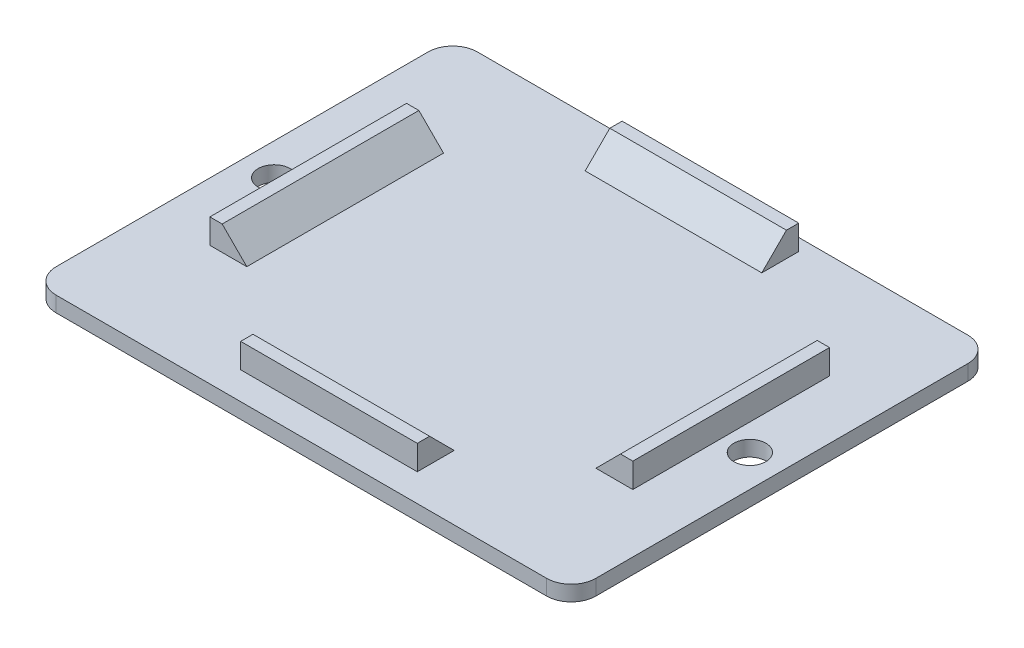
ISO-10303-21;
HEADER;
FILE_DESCRIPTION(('STEP AP214'),'2;1');
FILE_NAME('part.step','',(''),(''),'','','');
FILE_SCHEMA(('AUTOMOTIVE_DESIGN { 1 0 10303 214 1 1 1 1 }'));
ENDSEC;
DATA;
#1=APPLICATION_CONTEXT('core data for automotive mechanical design processes');
#2=APPLICATION_PROTOCOL_DEFINITION('international standard','automotive_design',2000,#1);
#3=PRODUCT_CONTEXT('',#1,'mechanical');
#4=PRODUCT('Part','Part','',(#3));
#5=PRODUCT_RELATED_PRODUCT_CATEGORY('part','',(#4));
#6=PRODUCT_DEFINITION_FORMATION('','',#4);
#7=PRODUCT_DEFINITION_CONTEXT('part definition',#1,'design');
#8=PRODUCT_DEFINITION('design','',#6,#7);
#9=PRODUCT_DEFINITION_SHAPE('','',#8);
#10=(LENGTH_UNIT() NAMED_UNIT(*) SI_UNIT(.MILLI.,.METRE.));
#11=(NAMED_UNIT(*) PLANE_ANGLE_UNIT() SI_UNIT($,.RADIAN.));
#12=(NAMED_UNIT(*) SI_UNIT($,.STERADIAN.) SOLID_ANGLE_UNIT());
#13=UNCERTAINTY_MEASURE_WITH_UNIT(LENGTH_MEASURE(1.E-05),#10,'distance_accuracy_value','');
#14=(GEOMETRIC_REPRESENTATION_CONTEXT(3) GLOBAL_UNCERTAINTY_ASSIGNED_CONTEXT((#13)) GLOBAL_UNIT_ASSIGNED_CONTEXT((#10,
#11,#12)) REPRESENTATION_CONTEXT('',''));
#15=CARTESIAN_POINT('',(0.,0.,0.));
#16=DIRECTION('',(0.,0.,1.));
#17=DIRECTION('',(1.,0.,0.));
#18=AXIS2_PLACEMENT_3D('',#15,#16,#17);
#19=CARTESIAN_POINT('',(0.,4.1275,0.));
#20=DIRECTION('',(0.,-1.,0.));
#21=DIRECTION('',(0.,0.,-1.));
#22=AXIS2_PLACEMENT_3D('',#19,#20,#21);
#23=PLANE('',#22);
#24=DIRECTION('',(0.,0.,1.));
#25=VECTOR('',#24,1.);
#26=CARTESIAN_POINT('',(9.10590000000001,4.1275,-20.4597));
#27=LINE('',#26,#25);
#28=CARTESIAN_POINT('',(9.10590000000001,4.1275,-20.4597));
#29=VERTEX_POINT('',#28);
#30=CARTESIAN_POINT('',(9.10590000000001,4.1275,-19.1897));
#31=VERTEX_POINT('',#30);
#32=EDGE_CURVE('E335',#29,#31,#27,.T.);
#33=ORIENTED_EDGE('',*,*,#32,.F.);
#34=DIRECTION('',(-1.,0.,0.));
#35=VECTOR('',#34,1.);
#36=CARTESIAN_POINT('',(-21.8059,4.1275,-20.4597));
#37=LINE('',#36,#35);
#38=CARTESIAN_POINT('',(-9.10590000000001,4.1275,-20.4597));
#39=VERTEX_POINT('',#38);
#40=EDGE_CURVE('E227',#29,#39,#37,.T.);
#41=ORIENTED_EDGE('',*,*,#40,.T.);
#42=DIRECTION('',(0.,0.,-1.));
#43=VECTOR('',#42,1.);
#44=CARTESIAN_POINT('',(-9.10590000000001,4.1275,-20.4597));
#45=LINE('',#44,#43);
#46=CARTESIAN_POINT('',(-9.10590000000001,4.1275,-19.1897));
#47=VERTEX_POINT('',#46);
#48=EDGE_CURVE('E334',#47,#39,#45,.T.);
#49=ORIENTED_EDGE('',*,*,#48,.F.);
#50=DIRECTION('',(-1.,0.,0.));
#51=VECTOR('',#50,1.);
#52=CARTESIAN_POINT('',(-20.5359,4.1275,-19.1897));
#53=LINE('',#52,#51);
#54=EDGE_CURVE('E319',#31,#47,#53,.T.);
#55=ORIENTED_EDGE('',*,*,#54,.F.);
#56=EDGE_LOOP('',(#33,#41,#49,#55));
#57=FACE_BOUND('',#56,.T.);
#58=ADVANCED_FACE('F34',(#57),#23,.F.);
#59=DIRECTION('',(1.,0.,0.));
#60=VECTOR('',#59,1.);
#61=CARTESIAN_POINT('',(21.8059,4.1275,-10.9347));
#62=LINE('',#61,#60);
#63=CARTESIAN_POINT('',(20.5359,4.1275,-10.9347));
#64=VERTEX_POINT('',#63);
#65=CARTESIAN_POINT('',(21.8059,4.1275,-10.9347));
#66=VERTEX_POINT('',#65);
#67=EDGE_CURVE('E713',#64,#66,#62,.T.);
#68=ORIENTED_EDGE('',*,*,#67,.F.);
#69=DIRECTION('',(0.,0.,-1.));
#70=VECTOR('',#69,1.);
#71=CARTESIAN_POINT('',(20.5359,4.1275,-19.1897));
#72=LINE('',#71,#70);
#73=CARTESIAN_POINT('',(20.5359,4.1275,9.3472));
#74=VERTEX_POINT('',#73);
#75=EDGE_CURVE('E235',#74,#64,#72,.T.);
#76=ORIENTED_EDGE('',*,*,#75,.F.);
#77=DIRECTION('',(-1.,0.,0.));
#78=VECTOR('',#77,1.);
#79=CARTESIAN_POINT('',(21.8059,4.1275,9.3472));
#80=LINE('',#79,#78);
#81=CARTESIAN_POINT('',(21.8059,4.1275,9.3472));
#82=VERTEX_POINT('',#81);
#83=EDGE_CURVE('E741',#82,#74,#80,.T.);
#84=ORIENTED_EDGE('',*,*,#83,.F.);
#85=DIRECTION('',(0.,0.,-1.));
#86=VECTOR('',#85,1.);
#87=CARTESIAN_POINT('',(21.8059,4.1275,-20.4597));
#88=LINE('',#87,#86);
#89=EDGE_CURVE('E220',#82,#66,#88,.T.);
#90=ORIENTED_EDGE('',*,*,#89,.T.);
#91=EDGE_LOOP('',(#68,#76,#84,#90));
#92=FACE_BOUND('',#91,.T.);
#93=ADVANCED_FACE('F447',(#92),#23,.F.);
#94=DIRECTION('',(0.,0.,1.));
#95=VECTOR('',#94,1.);
#96=CARTESIAN_POINT('',(9.10590000000001,4.1275,18.8722));
#97=LINE('',#96,#95);
#98=CARTESIAN_POINT('',(9.10590000000001,4.1275,17.6022));
#99=VERTEX_POINT('',#98);
#100=CARTESIAN_POINT('',(9.10590000000001,4.1275,18.8722));
#101=VERTEX_POINT('',#100);
#102=EDGE_CURVE('E744',#99,#101,#97,.T.);
#103=ORIENTED_EDGE('',*,*,#102,.F.);
#104=DIRECTION('',(1.,0.,0.));
#105=VECTOR('',#104,1.);
#106=CARTESIAN_POINT('',(-20.5359,4.1275,17.6022));
#107=LINE('',#106,#105);
#108=CARTESIAN_POINT('',(-9.10590000000001,4.1275,17.6022));
#109=VERTEX_POINT('',#108);
#110=EDGE_CURVE('E212',#109,#99,#107,.T.);
#111=ORIENTED_EDGE('',*,*,#110,.F.);
#112=DIRECTION('',(0.,0.,-1.));
#113=VECTOR('',#112,1.);
#114=CARTESIAN_POINT('',(-9.10590000000001,4.1275,18.8722));
#115=LINE('',#114,#113);
#116=CARTESIAN_POINT('',(-9.10590000000001,4.1275,18.8722));
#117=VERTEX_POINT('',#116);
#118=EDGE_CURVE('E198',#117,#109,#115,.T.);
#119=ORIENTED_EDGE('',*,*,#118,.F.);
#120=DIRECTION('',(1.,0.,0.));
#121=VECTOR('',#120,1.);
#122=CARTESIAN_POINT('',(-21.8059,4.1275,18.8722));
#123=LINE('',#122,#121);
#124=EDGE_CURVE('E210',#117,#101,#123,.T.);
#125=ORIENTED_EDGE('',*,*,#124,.T.);
#126=EDGE_LOOP('',(#103,#111,#119,#125));
#127=FACE_BOUND('',#126,.T.);
#128=ADVANCED_FACE('F209',(#127),#23,.F.);
#129=DIRECTION('',(-1.,0.,0.));
#130=VECTOR('',#129,1.);
#131=CARTESIAN_POINT('',(-21.8059,4.1275,9.3472));
#132=LINE('',#131,#130);
#133=CARTESIAN_POINT('',(-20.5359,4.1275,9.3472));
#134=VERTEX_POINT('',#133);
#135=CARTESIAN_POINT('',(-21.8059,4.1275,9.3472));
#136=VERTEX_POINT('',#135);
#137=EDGE_CURVE('E214',#134,#136,#132,.T.);
#138=ORIENTED_EDGE('',*,*,#137,.F.);
#139=DIRECTION('',(0.,0.,1.));
#140=VECTOR('',#139,1.);
#141=CARTESIAN_POINT('',(-20.5359,4.1275,-19.1897));
#142=LINE('',#141,#140);
#143=CARTESIAN_POINT('',(-20.5359,4.1275,-10.9347));
#144=VERTEX_POINT('',#143);
#145=EDGE_CURVE('E315',#144,#134,#142,.T.);
#146=ORIENTED_EDGE('',*,*,#145,.F.);
#147=DIRECTION('',(1.,0.,0.));
#148=VECTOR('',#147,1.);
#149=CARTESIAN_POINT('',(-21.8059,4.1275,-10.9347));
#150=LINE('',#149,#148);
#151=CARTESIAN_POINT('',(-21.8059,4.1275,-10.9347));
#152=VERTEX_POINT('',#151);
#153=EDGE_CURVE('E350',#152,#144,#150,.T.);
#154=ORIENTED_EDGE('',*,*,#153,.F.);
#155=DIRECTION('',(0.,0.,1.));
#156=VECTOR('',#155,1.);
#157=CARTESIAN_POINT('',(-21.8059,4.1275,-20.4597));
#158=LINE('',#157,#156);
#159=EDGE_CURVE('E221',#152,#136,#158,.T.);
#160=ORIENTED_EDGE('',*,*,#159,.T.);
#161=EDGE_LOOP('',(#138,#146,#154,#160));
#162=FACE_BOUND('',#161,.T.);
#163=ADVANCED_FACE('F313',(#162),#23,.F.);
#164=CARTESIAN_POINT('',(-21.8059,4.1275,-20.4597));
#165=DIRECTION('',(0.,0.,1.));
#166=DIRECTION('',(1.,0.,0.));
#167=AXIS2_PLACEMENT_3D('',#164,#165,#166);
#168=PLANE('',#167);
#169=DIRECTION('',(0.,-1.,0.));
#170=VECTOR('',#169,1.);
#171=CARTESIAN_POINT('',(9.10590000000001,4.1275,-20.4597));
#172=LINE('',#171,#170);
#173=CARTESIAN_POINT('',(9.10590000000001,1.5875,-20.4597));
#174=VERTEX_POINT('',#173);
#175=EDGE_CURVE('E340',#29,#174,#172,.T.);
#176=ORIENTED_EDGE('',*,*,#175,.T.);
#177=DIRECTION('',(-1.,0.,0.));
#178=VECTOR('',#177,1.);
#179=CARTESIAN_POINT('',(-21.8059,1.5875,-20.4597));
#180=LINE('',#179,#178);
#181=CARTESIAN_POINT('',(-9.10590000000001,1.5875,-20.4597));
#182=VERTEX_POINT('',#181);
#183=EDGE_CURVE('E231',#174,#182,#180,.T.);
#184=ORIENTED_EDGE('',*,*,#183,.T.);
#185=DIRECTION('',(0.,-1.,0.));
#186=VECTOR('',#185,1.);
#187=CARTESIAN_POINT('',(-9.10590000000001,4.1275,-20.4597));
#188=LINE('',#187,#186);
#189=EDGE_CURVE('E343',#39,#182,#188,.T.);
#190=ORIENTED_EDGE('',*,*,#189,.F.);
#191=ORIENTED_EDGE('',*,*,#40,.F.);
#192=EDGE_LOOP('',(#176,#184,#190,#191));
#193=FACE_BOUND('',#192,.T.);
#194=ADVANCED_FACE('F339',(#193),#168,.F.);
#195=CARTESIAN_POINT('',(-21.8059,4.1275,-20.4597));
#196=DIRECTION('',(1.,0.,0.));
#197=DIRECTION('',(0.,0.,-1.));
#198=AXIS2_PLACEMENT_3D('',#195,#196,#197);
#199=PLANE('',#198);
#200=DIRECTION('',(0.,-1.,0.));
#201=VECTOR('',#200,1.);
#202=CARTESIAN_POINT('',(-21.8059,4.1275,9.3472));
#203=LINE('',#202,#201);
#204=CARTESIAN_POINT('',(-21.8059,1.5875,9.3472));
#205=VERTEX_POINT('',#204);
#206=EDGE_CURVE('E204',#136,#205,#203,.T.);
#207=ORIENTED_EDGE('',*,*,#206,.F.);
#208=ORIENTED_EDGE('',*,*,#159,.F.);
#209=DIRECTION('',(0.,-1.,0.));
#210=VECTOR('',#209,1.);
#211=CARTESIAN_POINT('',(-21.8059,4.1275,-10.9347));
#212=LINE('',#211,#210);
#213=CARTESIAN_POINT('',(-21.8059,1.5875,-10.9347));
#214=VERTEX_POINT('',#213);
#215=EDGE_CURVE('E345',#152,#214,#212,.T.);
#216=ORIENTED_EDGE('',*,*,#215,.T.);
#217=DIRECTION('',(0.,0.,1.));
#218=VECTOR('',#217,1.);
#219=CARTESIAN_POINT('',(-21.8059,1.5875,-20.4597));
#220=LINE('',#219,#218);
#221=EDGE_CURVE('E234',#214,#205,#220,.T.);
#222=ORIENTED_EDGE('',*,*,#221,.T.);
#223=EDGE_LOOP('',(#207,#208,#216,#222));
#224=FACE_BOUND('',#223,.T.);
#225=ADVANCED_FACE('F460',(#224),#199,.F.);
#226=CARTESIAN_POINT('',(-21.8059,4.1275,18.8722));
#227=DIRECTION('',(0.,0.,-1.));
#228=DIRECTION('',(-1.,0.,0.));
#229=AXIS2_PLACEMENT_3D('',#226,#227,#228);
#230=PLANE('',#229);
#231=DIRECTION('',(0.,-1.,0.));
#232=VECTOR('',#231,1.);
#233=CARTESIAN_POINT('',(9.10590000000001,4.1275,18.8722));
#234=LINE('',#233,#232);
#235=CARTESIAN_POINT('',(9.10590000000001,1.5875,18.8722));
#236=VERTEX_POINT('',#235);
#237=EDGE_CURVE('E219',#101,#236,#234,.T.);
#238=ORIENTED_EDGE('',*,*,#237,.F.);
#239=ORIENTED_EDGE('',*,*,#124,.F.);
#240=DIRECTION('',(0.,-1.,0.));
#241=VECTOR('',#240,1.);
#242=CARTESIAN_POINT('',(-9.10590000000001,4.1275,18.8722));
#243=LINE('',#242,#241);
#244=CARTESIAN_POINT('',(-9.10590000000001,1.5875,18.8722));
#245=VERTEX_POINT('',#244);
#246=EDGE_CURVE('E195',#117,#245,#243,.T.);
#247=ORIENTED_EDGE('',*,*,#246,.T.);
#248=DIRECTION('',(1.,0.,0.));
#249=VECTOR('',#248,1.);
#250=CARTESIAN_POINT('',(-21.8059,1.5875,18.8722));
#251=LINE('',#250,#249);
#252=EDGE_CURVE('E238',#245,#236,#251,.T.);
#253=ORIENTED_EDGE('',*,*,#252,.T.);
#254=EDGE_LOOP('',(#238,#239,#247,#253));
#255=FACE_BOUND('',#254,.T.);
#256=ADVANCED_FACE('F218',(#255),#230,.F.);
#257=CARTESIAN_POINT('',(21.8059,4.1275,-20.4597));
#258=DIRECTION('',(-1.,0.,0.));
#259=DIRECTION('',(0.,0.,1.));
#260=AXIS2_PLACEMENT_3D('',#257,#258,#259);
#261=PLANE('',#260);
#262=DIRECTION('',(0.,-1.,0.));
#263=VECTOR('',#262,1.);
#264=CARTESIAN_POINT('',(21.8059,4.1275,-10.9347));
#265=LINE('',#264,#263);
#266=CARTESIAN_POINT('',(21.8059,1.5875,-10.9347));
#267=VERTEX_POINT('',#266);
#268=EDGE_CURVE('E716',#66,#267,#265,.T.);
#269=ORIENTED_EDGE('',*,*,#268,.F.);
#270=ORIENTED_EDGE('',*,*,#89,.F.);
#271=DIRECTION('',(0.,-1.,0.));
#272=VECTOR('',#271,1.);
#273=CARTESIAN_POINT('',(21.8059,4.1275,9.3472));
#274=LINE('',#273,#272);
#275=CARTESIAN_POINT('',(21.8059,1.5875,9.3472));
#276=VERTEX_POINT('',#275);
#277=EDGE_CURVE('E720',#82,#276,#274,.T.);
#278=ORIENTED_EDGE('',*,*,#277,.T.);
#279=DIRECTION('',(0.,0.,-1.));
#280=VECTOR('',#279,1.);
#281=CARTESIAN_POINT('',(21.8059,1.5875,-20.4597));
#282=LINE('',#281,#280);
#283=EDGE_CURVE('E240',#276,#267,#282,.T.);
#284=ORIENTED_EDGE('',*,*,#283,.T.);
#285=EDGE_LOOP('',(#269,#270,#278,#284));
#286=FACE_BOUND('',#285,.T.);
#287=ADVANCED_FACE('F478',(#286),#261,.F.);
#288=CARTESIAN_POINT('',(0.,0.,0.));
#289=DIRECTION('',(0.,1.,0.));
#290=DIRECTION('',(0.,0.,1.));
#291=AXIS2_PLACEMENT_3D('',#288,#289,#290);
#292=PLANE('',#291);
#293=CARTESIAN_POINT('',(24.5237,0.,0.));
#294=DIRECTION('',(0.,1.,0.));
#295=DIRECTION('',(0.,0.,1.));
#296=AXIS2_PLACEMENT_3D('',#293,#294,#295);
#297=CIRCLE('',#296,1.651);
#298=CARTESIAN_POINT('',(24.5237,0.,1.651));
#299=VERTEX_POINT('',#298);
#300=EDGE_CURVE('E385',#299,#299,#297,.T.);
#301=ORIENTED_EDGE('',*,*,#300,.T.);
#302=EDGE_LOOP('',(#301));
#303=FACE_BOUND('',#302,.T.);
#304=CARTESIAN_POINT('',(-24.5237,0.,0.));
#305=DIRECTION('',(0.,1.,0.));
#306=DIRECTION('',(0.,0.,1.));
#307=AXIS2_PLACEMENT_3D('',#304,#305,#306);
#308=CIRCLE('',#307,1.651);
#309=CARTESIAN_POINT('',(-24.5237,0.,1.651));
#310=VERTEX_POINT('',#309);
#311=EDGE_CURVE('E323',#310,#310,#308,.T.);
#312=ORIENTED_EDGE('',*,*,#311,.T.);
#313=EDGE_LOOP('',(#312));
#314=FACE_BOUND('',#313,.T.);
#315=DIRECTION('',(1.,0.,0.));
#316=VECTOR('',#315,1.);
#317=CARTESIAN_POINT('',(-27.8257,0.,21.717));
#318=LINE('',#317,#316);
#319=CARTESIAN_POINT('',(-25.2857,0.,21.717));
#320=VERTEX_POINT('',#319);
#321=CARTESIAN_POINT('',(25.2857,0.,21.717));
#322=VERTEX_POINT('',#321);
#323=EDGE_CURVE('E366',#320,#322,#318,.T.);
#324=ORIENTED_EDGE('',*,*,#323,.F.);
#325=CARTESIAN_POINT('',(-25.2857,0.,19.177));
#326=DIRECTION('',(0.,1.,0.));
#327=DIRECTION('',(0.,0.,1.));
#328=AXIS2_PLACEMENT_3D('',#325,#326,#327);
#329=CIRCLE('',#328,2.54);
#330=CARTESIAN_POINT('',(-27.8257,0.,19.177));
#331=VERTEX_POINT('',#330);
#332=EDGE_CURVE('E266',#320,#331,#329,.F.);
#333=ORIENTED_EDGE('',*,*,#332,.T.);
#334=DIRECTION('',(0.,0.,1.));
#335=VECTOR('',#334,1.);
#336=CARTESIAN_POINT('',(-27.8257,0.,-21.717));
#337=LINE('',#336,#335);
#338=CARTESIAN_POINT('',(-27.8257,0.,-19.177));
#339=VERTEX_POINT('',#338);
#340=EDGE_CURVE('E363',#339,#331,#337,.T.);
#341=ORIENTED_EDGE('',*,*,#340,.F.);
#342=CARTESIAN_POINT('',(-25.2857,0.,-19.177));
#343=DIRECTION('',(0.,1.,0.));
#344=DIRECTION('',(0.,0.,1.));
#345=AXIS2_PLACEMENT_3D('',#342,#343,#344);
#346=CIRCLE('',#345,2.54);
#347=CARTESIAN_POINT('',(-25.2857,0.,-21.717));
#348=VERTEX_POINT('',#347);
#349=EDGE_CURVE('E260',#339,#348,#346,.F.);
#350=ORIENTED_EDGE('',*,*,#349,.T.);
#351=DIRECTION('',(-1.,0.,0.));
#352=VECTOR('',#351,1.);
#353=CARTESIAN_POINT('',(27.8257,0.,-21.717));
#354=LINE('',#353,#352);
#355=CARTESIAN_POINT('',(25.2857,0.,-21.717));
#356=VERTEX_POINT('',#355);
#357=EDGE_CURVE('E359',#356,#348,#354,.T.);
#358=ORIENTED_EDGE('',*,*,#357,.F.);
#359=CARTESIAN_POINT('',(25.2857,0.,-19.177));
#360=DIRECTION('',(0.,1.,0.));
#361=DIRECTION('',(0.,0.,1.));
#362=AXIS2_PLACEMENT_3D('',#359,#360,#361);
#363=CIRCLE('',#362,2.54);
#364=CARTESIAN_POINT('',(27.8257,0.,-19.177));
#365=VERTEX_POINT('',#364);
#366=EDGE_CURVE('E262',#356,#365,#363,.F.);
#367=ORIENTED_EDGE('',*,*,#366,.T.);
#368=DIRECTION('',(0.,0.,-1.));
#369=VECTOR('',#368,1.);
#370=CARTESIAN_POINT('',(27.8257,0.,21.717));
#371=LINE('',#370,#369);
#372=CARTESIAN_POINT('',(27.8257,0.,19.177));
#373=VERTEX_POINT('',#372);
#374=EDGE_CURVE('E356',#373,#365,#371,.T.);
#375=ORIENTED_EDGE('',*,*,#374,.F.);
#376=CARTESIAN_POINT('',(25.2857,0.,19.177));
#377=DIRECTION('',(0.,1.,0.));
#378=DIRECTION('',(0.,0.,1.));
#379=AXIS2_PLACEMENT_3D('',#376,#377,#378);
#380=CIRCLE('',#379,2.54);
#381=EDGE_CURVE('E264',#373,#322,#380,.F.);
#382=ORIENTED_EDGE('',*,*,#381,.T.);
#383=EDGE_LOOP('',(#324,#333,#341,#350,#358,#367,#375,#382));
#384=FACE_BOUND('',#383,.T.);
#385=ADVANCED_FACE('F395',(#303,#314,#384),#292,.F.);
#386=CARTESIAN_POINT('',(0.,1.5875,0.));
#387=DIRECTION('',(0.,1.,0.));
#388=DIRECTION('',(0.,0.,1.));
#389=AXIS2_PLACEMENT_3D('',#386,#387,#388);
#390=PLANE('',#389);
#391=DIRECTION('',(-1.,0.,0.));
#392=VECTOR('',#391,1.);
#393=CARTESIAN_POINT('',(-9.10590000000001,1.5875,-16.6497));
#394=LINE('',#393,#392);
#395=CARTESIAN_POINT('',(9.10590000000001,1.5875,-16.6497));
#396=VERTEX_POINT('',#395);
#397=CARTESIAN_POINT('',(-9.10590000000001,1.5875,-16.6497));
#398=VERTEX_POINT('',#397);
#399=EDGE_CURVE('E281',#396,#398,#394,.T.);
#400=ORIENTED_EDGE('',*,*,#399,.T.);
#401=DIRECTION('',(0.,0.,-1.));
#402=VECTOR('',#401,1.);
#403=CARTESIAN_POINT('',(-9.10590000000001,1.5875,-20.4597));
#404=LINE('',#403,#402);
#405=EDGE_CURVE('E353',#398,#182,#404,.T.);
#406=ORIENTED_EDGE('',*,*,#405,.T.);
#407=ORIENTED_EDGE('',*,*,#183,.F.);
#408=DIRECTION('',(0.,0.,1.));
#409=VECTOR('',#408,1.);
#410=CARTESIAN_POINT('',(9.10590000000001,1.5875,-20.4597));
#411=LINE('',#410,#409);
#412=EDGE_CURVE('E712',#174,#396,#411,.T.);
#413=ORIENTED_EDGE('',*,*,#412,.T.);
#414=EDGE_LOOP('',(#400,#406,#407,#413));
#415=FACE_BOUND('',#414,.T.);
#416=DIRECTION('',(0.,0.,1.));
#417=VECTOR('',#416,1.);
#418=CARTESIAN_POINT('',(-17.9959,1.5875,9.3472));
#419=LINE('',#418,#417);
#420=CARTESIAN_POINT('',(-17.9959,1.5875,-10.9347));
#421=VERTEX_POINT('',#420);
#422=CARTESIAN_POINT('',(-17.9959,1.5875,9.3472));
#423=VERTEX_POINT('',#422);
#424=EDGE_CURVE('E278',#421,#423,#419,.T.);
#425=ORIENTED_EDGE('',*,*,#424,.T.);
#426=DIRECTION('',(-1.,0.,0.));
#427=VECTOR('',#426,1.);
#428=CARTESIAN_POINT('',(-21.8059,1.5875,9.3472));
#429=LINE('',#428,#427);
#430=EDGE_CURVE('E215',#423,#205,#429,.T.);
#431=ORIENTED_EDGE('',*,*,#430,.T.);
#432=ORIENTED_EDGE('',*,*,#221,.F.);
#433=DIRECTION('',(1.,0.,0.));
#434=VECTOR('',#433,1.);
#435=CARTESIAN_POINT('',(-21.8059,1.5875,-10.9347));
#436=LINE('',#435,#434);
#437=EDGE_CURVE('E203',#214,#421,#436,.T.);
#438=ORIENTED_EDGE('',*,*,#437,.T.);
#439=EDGE_LOOP('',(#425,#431,#432,#438));
#440=FACE_BOUND('',#439,.T.);
#441=DIRECTION('',(1.,0.,0.));
#442=VECTOR('',#441,1.);
#443=CARTESIAN_POINT('',(9.10590000000001,1.5875,15.0622));
#444=LINE('',#443,#442);
#445=CARTESIAN_POINT('',(-9.10590000000001,1.5875,15.0622));
#446=VERTEX_POINT('',#445);
#447=CARTESIAN_POINT('',(9.10590000000001,1.5875,15.0622));
#448=VERTEX_POINT('',#447);
#449=EDGE_CURVE('E287',#446,#448,#444,.T.);
#450=ORIENTED_EDGE('',*,*,#449,.T.);
#451=DIRECTION('',(0.,0.,1.));
#452=VECTOR('',#451,1.);
#453=CARTESIAN_POINT('',(9.10590000000001,1.5875,18.8722));
#454=LINE('',#453,#452);
#455=EDGE_CURVE('E49',#448,#236,#454,.T.);
#456=ORIENTED_EDGE('',*,*,#455,.T.);
#457=ORIENTED_EDGE('',*,*,#252,.F.);
#458=DIRECTION('',(0.,0.,-1.));
#459=VECTOR('',#458,1.);
#460=CARTESIAN_POINT('',(-9.10590000000001,1.5875,18.8722));
#461=LINE('',#460,#459);
#462=EDGE_CURVE('E57',#245,#446,#461,.T.);
#463=ORIENTED_EDGE('',*,*,#462,.T.);
#464=EDGE_LOOP('',(#450,#456,#457,#463));
#465=FACE_BOUND('',#464,.T.);
#466=DIRECTION('',(0.,0.,-1.));
#467=VECTOR('',#466,1.);
#468=CARTESIAN_POINT('',(17.9959,1.5875,-10.9347));
#469=LINE('',#468,#467);
#470=CARTESIAN_POINT('',(17.9959,1.5875,9.3472));
#471=VERTEX_POINT('',#470);
#472=CARTESIAN_POINT('',(17.9959,1.5875,-10.9347));
#473=VERTEX_POINT('',#472);
#474=EDGE_CURVE('E284',#471,#473,#469,.T.);
#475=ORIENTED_EDGE('',*,*,#474,.T.);
#476=DIRECTION('',(1.,0.,0.));
#477=VECTOR('',#476,1.);
#478=CARTESIAN_POINT('',(21.8059,1.5875,-10.9347));
#479=LINE('',#478,#477);
#480=EDGE_CURVE('E714',#473,#267,#479,.T.);
#481=ORIENTED_EDGE('',*,*,#480,.T.);
#482=ORIENTED_EDGE('',*,*,#283,.F.);
#483=DIRECTION('',(-1.,0.,0.));
#484=VECTOR('',#483,1.);
#485=CARTESIAN_POINT('',(21.8059,1.5875,9.3472));
#486=LINE('',#485,#484);
#487=EDGE_CURVE('E727',#276,#471,#486,.T.);
#488=ORIENTED_EDGE('',*,*,#487,.T.);
#489=EDGE_LOOP('',(#475,#481,#482,#488));
#490=FACE_BOUND('',#489,.T.);
#491=CARTESIAN_POINT('',(24.5237,1.5875,0.));
#492=DIRECTION('',(0.,1.,0.));
#493=DIRECTION('',(0.,0.,1.));
#494=AXIS2_PLACEMENT_3D('',#491,#492,#493);
#495=CIRCLE('',#494,1.651);
#496=CARTESIAN_POINT('',(24.5237,1.5875,1.651));
#497=VERTEX_POINT('',#496);
#498=EDGE_CURVE('E369',#497,#497,#495,.T.);
#499=ORIENTED_EDGE('',*,*,#498,.F.);
#500=EDGE_LOOP('',(#499));
#501=FACE_BOUND('',#500,.T.);
#502=CARTESIAN_POINT('',(-24.5237,1.5875,0.));
#503=DIRECTION('',(0.,1.,0.));
#504=DIRECTION('',(0.,0.,1.));
#505=AXIS2_PLACEMENT_3D('',#502,#503,#504);
#506=CIRCLE('',#505,1.651);
#507=CARTESIAN_POINT('',(-24.5237,1.5875,1.651));
#508=VERTEX_POINT('',#507);
#509=EDGE_CURVE('E382',#508,#508,#506,.T.);
#510=ORIENTED_EDGE('',*,*,#509,.F.);
#511=EDGE_LOOP('',(#510));
#512=FACE_BOUND('',#511,.T.);
#513=DIRECTION('',(0.,0.,1.));
#514=VECTOR('',#513,1.);
#515=CARTESIAN_POINT('',(-27.8257,1.5875,-21.717));
#516=LINE('',#515,#514);
#517=CARTESIAN_POINT('',(-27.8257,1.5875,-19.177));
#518=VERTEX_POINT('',#517);
#519=CARTESIAN_POINT('',(-27.8257,1.5875,19.177));
#520=VERTEX_POINT('',#519);
#521=EDGE_CURVE('E375',#518,#520,#516,.T.);
#522=ORIENTED_EDGE('',*,*,#521,.T.);
#523=CARTESIAN_POINT('',(-25.2857,1.5875,19.177));
#524=DIRECTION('',(0.,1.,0.));
#525=DIRECTION('',(0.,0.,1.));
#526=AXIS2_PLACEMENT_3D('',#523,#524,#525);
#527=CIRCLE('',#526,2.54);
#528=CARTESIAN_POINT('',(-25.2857,1.5875,21.717));
#529=VERTEX_POINT('',#528);
#530=EDGE_CURVE('E253',#520,#529,#527,.T.);
#531=ORIENTED_EDGE('',*,*,#530,.T.);
#532=DIRECTION('',(1.,0.,0.));
#533=VECTOR('',#532,1.);
#534=CARTESIAN_POINT('',(-27.8257,1.5875,21.717));
#535=LINE('',#534,#533);
#536=CARTESIAN_POINT('',(25.2857,1.5875,21.717));
#537=VERTEX_POINT('',#536);
#538=EDGE_CURVE('E360',#529,#537,#535,.T.);
#539=ORIENTED_EDGE('',*,*,#538,.T.);
#540=CARTESIAN_POINT('',(25.2857,1.5875,19.177));
#541=DIRECTION('',(0.,1.,0.));
#542=DIRECTION('',(0.,0.,1.));
#543=AXIS2_PLACEMENT_3D('',#540,#541,#542);
#544=CIRCLE('',#543,2.54);
#545=CARTESIAN_POINT('',(27.8257,1.5875,19.177));
#546=VERTEX_POINT('',#545);
#547=EDGE_CURVE('E251',#537,#546,#544,.T.);
#548=ORIENTED_EDGE('',*,*,#547,.T.);
#549=DIRECTION('',(0.,0.,-1.));
#550=VECTOR('',#549,1.);
#551=CARTESIAN_POINT('',(27.8257,1.5875,21.717));
#552=LINE('',#551,#550);
#553=CARTESIAN_POINT('',(27.8257,1.5875,-19.177));
#554=VERTEX_POINT('',#553);
#555=EDGE_CURVE('E348',#546,#554,#552,.T.);
#556=ORIENTED_EDGE('',*,*,#555,.T.);
#557=CARTESIAN_POINT('',(25.2857,1.5875,-19.177));
#558=DIRECTION('',(0.,1.,0.));
#559=DIRECTION('',(0.,0.,1.));
#560=AXIS2_PLACEMENT_3D('',#557,#558,#559);
#561=CIRCLE('',#560,2.54);
#562=CARTESIAN_POINT('',(25.2857,1.5875,-21.717));
#563=VERTEX_POINT('',#562);
#564=EDGE_CURVE('E249',#554,#563,#561,.T.);
#565=ORIENTED_EDGE('',*,*,#564,.T.);
#566=DIRECTION('',(-1.,0.,0.));
#567=VECTOR('',#566,1.);
#568=CARTESIAN_POINT('',(27.8257,1.5875,-21.717));
#569=LINE('',#568,#567);
#570=CARTESIAN_POINT('',(-25.2857,1.5875,-21.717));
#571=VERTEX_POINT('',#570);
#572=EDGE_CURVE('E372',#563,#571,#569,.T.);
#573=ORIENTED_EDGE('',*,*,#572,.T.);
#574=CARTESIAN_POINT('',(-25.2857,1.5875,-19.177));
#575=DIRECTION('',(0.,1.,0.));
#576=DIRECTION('',(0.,0.,1.));
#577=AXIS2_PLACEMENT_3D('',#574,#575,#576);
#578=CIRCLE('',#577,2.54);
#579=EDGE_CURVE('E247',#571,#518,#578,.T.);
#580=ORIENTED_EDGE('',*,*,#579,.T.);
#581=EDGE_LOOP('',(#522,#531,#539,#548,#556,#565,#573,#580));
#582=FACE_BOUND('',#581,.T.);
#583=ADVANCED_FACE('F392',(#415,#440,#465,#490,#501,#512,#582),#390,.T.);
#584=CARTESIAN_POINT('',(24.5237,0.,0.));
#585=DIRECTION('',(0.,1.,0.));
#586=DIRECTION('',(0.,0.,1.));
#587=AXIS2_PLACEMENT_3D('',#584,#585,#586);
#588=CYLINDRICAL_SURFACE('',#587,1.651);
#589=ORIENTED_EDGE('',*,*,#300,.F.);
#590=EDGE_LOOP('',(#589));
#591=FACE_BOUND('',#590,.T.);
#592=ORIENTED_EDGE('',*,*,#498,.T.);
#593=EDGE_LOOP('',(#592));
#594=FACE_BOUND('',#593,.T.);
#595=ADVANCED_FACE('F390',(#591,#594),#588,.F.);
#596=CARTESIAN_POINT('',(-24.5237,0.,0.));
#597=DIRECTION('',(0.,1.,0.));
#598=DIRECTION('',(0.,0.,1.));
#599=AXIS2_PLACEMENT_3D('',#596,#597,#598);
#600=CYLINDRICAL_SURFACE('',#599,1.651);
#601=ORIENTED_EDGE('',*,*,#311,.F.);
#602=EDGE_LOOP('',(#601));
#603=FACE_BOUND('',#602,.T.);
#604=ORIENTED_EDGE('',*,*,#509,.T.);
#605=EDGE_LOOP('',(#604));
#606=FACE_BOUND('',#605,.T.);
#607=ADVANCED_FACE('F566',(#603,#606),#600,.F.);
#608=CARTESIAN_POINT('',(27.8257,0.,21.717));
#609=DIRECTION('',(1.,0.,0.));
#610=DIRECTION('',(0.,0.,-1.));
#611=AXIS2_PLACEMENT_3D('',#608,#609,#610);
#612=PLANE('',#611);
#613=ORIENTED_EDGE('',*,*,#555,.F.);
#614=DIRECTION('',(0.,1.,0.));
#615=VECTOR('',#614,1.);
#616=CARTESIAN_POINT('',(27.8257,0.,19.177));
#617=LINE('',#616,#615);
#618=EDGE_CURVE('E271',#546,#373,#617,.F.);
#619=ORIENTED_EDGE('',*,*,#618,.T.);
#620=ORIENTED_EDGE('',*,*,#374,.T.);
#621=DIRECTION('',(0.,1.,0.));
#622=VECTOR('',#621,1.);
#623=CARTESIAN_POINT('',(27.8257,0.,-19.177));
#624=LINE('',#623,#622);
#625=EDGE_CURVE('E268',#365,#554,#624,.T.);
#626=ORIENTED_EDGE('',*,*,#625,.T.);
#627=EDGE_LOOP('',(#613,#619,#620,#626));
#628=FACE_BOUND('',#627,.T.);
#629=ADVANCED_FACE('F426',(#628),#612,.T.);
#630=CARTESIAN_POINT('',(-27.8257,0.,21.717));
#631=DIRECTION('',(0.,0.,1.));
#632=DIRECTION('',(1.,0.,0.));
#633=AXIS2_PLACEMENT_3D('',#630,#631,#632);
#634=PLANE('',#633);
#635=ORIENTED_EDGE('',*,*,#538,.F.);
#636=DIRECTION('',(0.,1.,0.));
#637=VECTOR('',#636,1.);
#638=CARTESIAN_POINT('',(-25.2857,0.,21.717));
#639=LINE('',#638,#637);
#640=EDGE_CURVE('E258',#529,#320,#639,.F.);
#641=ORIENTED_EDGE('',*,*,#640,.T.);
#642=ORIENTED_EDGE('',*,*,#323,.T.);
#643=DIRECTION('',(0.,1.,0.));
#644=VECTOR('',#643,1.);
#645=CARTESIAN_POINT('',(25.2857,0.,21.717));
#646=LINE('',#645,#644);
#647=EDGE_CURVE('E255',#322,#537,#646,.T.);
#648=ORIENTED_EDGE('',*,*,#647,.T.);
#649=EDGE_LOOP('',(#635,#641,#642,#648));
#650=FACE_BOUND('',#649,.T.);
#651=ADVANCED_FACE('F433',(#650),#634,.T.);
#652=CARTESIAN_POINT('',(-27.8257,0.,-21.717));
#653=DIRECTION('',(-1.,0.,0.));
#654=DIRECTION('',(0.,0.,1.));
#655=AXIS2_PLACEMENT_3D('',#652,#653,#654);
#656=PLANE('',#655);
#657=ORIENTED_EDGE('',*,*,#340,.T.);
#658=DIRECTION('',(0.,1.,0.));
#659=VECTOR('',#658,1.);
#660=CARTESIAN_POINT('',(-27.8257,0.,19.177));
#661=LINE('',#660,#659);
#662=EDGE_CURVE('E244',#331,#520,#661,.T.);
#663=ORIENTED_EDGE('',*,*,#662,.T.);
#664=ORIENTED_EDGE('',*,*,#521,.F.);
#665=DIRECTION('',(0.,1.,0.));
#666=VECTOR('',#665,1.);
#667=CARTESIAN_POINT('',(-27.8257,0.,-19.177));
#668=LINE('',#667,#666);
#669=EDGE_CURVE('E224',#518,#339,#668,.F.);
#670=ORIENTED_EDGE('',*,*,#669,.T.);
#671=EDGE_LOOP('',(#657,#663,#664,#670));
#672=FACE_BOUND('',#671,.T.);
#673=ADVANCED_FACE('F404',(#672),#656,.T.);
#674=CARTESIAN_POINT('',(27.8257,0.,-21.717));
#675=DIRECTION('',(0.,0.,-1.));
#676=DIRECTION('',(-1.,0.,0.));
#677=AXIS2_PLACEMENT_3D('',#674,#675,#676);
#678=PLANE('',#677);
#679=ORIENTED_EDGE('',*,*,#572,.F.);
#680=DIRECTION('',(0.,1.,0.));
#681=VECTOR('',#680,1.);
#682=CARTESIAN_POINT('',(25.2857,0.,-21.717));
#683=LINE('',#682,#681);
#684=EDGE_CURVE('E276',#563,#356,#683,.F.);
#685=ORIENTED_EDGE('',*,*,#684,.T.);
#686=ORIENTED_EDGE('',*,*,#357,.T.);
#687=DIRECTION('',(0.,1.,0.));
#688=VECTOR('',#687,1.);
#689=CARTESIAN_POINT('',(-25.2857,0.,-21.717));
#690=LINE('',#689,#688);
#691=EDGE_CURVE('E273',#348,#571,#690,.T.);
#692=ORIENTED_EDGE('',*,*,#691,.T.);
#693=EDGE_LOOP('',(#679,#685,#686,#692));
#694=FACE_BOUND('',#693,.T.);
#695=ADVANCED_FACE('F417',(#694),#678,.T.);
#696=CARTESIAN_POINT('',(-25.2857,0.,19.177));
#697=DIRECTION('',(0.,1.,0.));
#698=DIRECTION('',(0.,0.,1.));
#699=AXIS2_PLACEMENT_3D('',#696,#697,#698);
#700=CYLINDRICAL_SURFACE('',#699,2.54);
#701=ORIENTED_EDGE('',*,*,#332,.F.);
#702=ORIENTED_EDGE('',*,*,#640,.F.);
#703=ORIENTED_EDGE('',*,*,#530,.F.);
#704=ORIENTED_EDGE('',*,*,#662,.F.);
#705=EDGE_LOOP('',(#701,#702,#703,#704));
#706=FACE_BOUND('',#705,.T.);
#707=ADVANCED_FACE('F436',(#706),#700,.T.);
#708=CARTESIAN_POINT('',(25.2857,0.,19.177));
#709=DIRECTION('',(0.,1.,0.));
#710=DIRECTION('',(0.,0.,1.));
#711=AXIS2_PLACEMENT_3D('',#708,#709,#710);
#712=CYLINDRICAL_SURFACE('',#711,2.54);
#713=ORIENTED_EDGE('',*,*,#381,.F.);
#714=ORIENTED_EDGE('',*,*,#618,.F.);
#715=ORIENTED_EDGE('',*,*,#547,.F.);
#716=ORIENTED_EDGE('',*,*,#647,.F.);
#717=EDGE_LOOP('',(#713,#714,#715,#716));
#718=FACE_BOUND('',#717,.T.);
#719=ADVANCED_FACE('F429',(#718),#712,.T.);
#720=CARTESIAN_POINT('',(25.2857,0.,-19.177));
#721=DIRECTION('',(0.,1.,0.));
#722=DIRECTION('',(0.,0.,1.));
#723=AXIS2_PLACEMENT_3D('',#720,#721,#722);
#724=CYLINDRICAL_SURFACE('',#723,2.54);
#725=ORIENTED_EDGE('',*,*,#366,.F.);
#726=ORIENTED_EDGE('',*,*,#684,.F.);
#727=ORIENTED_EDGE('',*,*,#564,.F.);
#728=ORIENTED_EDGE('',*,*,#625,.F.);
#729=EDGE_LOOP('',(#725,#726,#727,#728));
#730=FACE_BOUND('',#729,.T.);
#731=ADVANCED_FACE('F420',(#730),#724,.T.);
#732=CARTESIAN_POINT('',(-25.2857,0.,-19.177));
#733=DIRECTION('',(0.,1.,0.));
#734=DIRECTION('',(0.,0.,1.));
#735=AXIS2_PLACEMENT_3D('',#732,#733,#734);
#736=CYLINDRICAL_SURFACE('',#735,2.54);
#737=ORIENTED_EDGE('',*,*,#349,.F.);
#738=ORIENTED_EDGE('',*,*,#669,.F.);
#739=ORIENTED_EDGE('',*,*,#579,.F.);
#740=ORIENTED_EDGE('',*,*,#691,.F.);
#741=EDGE_LOOP('',(#737,#738,#739,#740));
#742=FACE_BOUND('',#741,.T.);
#743=ADVANCED_FACE('F409',(#742),#736,.T.);
#744=CARTESIAN_POINT('',(21.8059,4.1275,9.3472));
#745=DIRECTION('',(0.,0.,1.));
#746=DIRECTION('',(1.,0.,0.));
#747=AXIS2_PLACEMENT_3D('',#744,#745,#746);
#748=PLANE('',#747);
#749=ORIENTED_EDGE('',*,*,#487,.F.);
#750=ORIENTED_EDGE('',*,*,#277,.F.);
#751=ORIENTED_EDGE('',*,*,#83,.T.);
#752=DIRECTION('',(0.70710678118655,0.707106781186545,0.));
#753=VECTOR('',#752,1.);
#754=CARTESIAN_POINT('',(17.9959,1.5875,9.3472));
#755=LINE('',#754,#753);
#756=EDGE_CURVE('E295',#74,#471,#755,.F.);
#757=ORIENTED_EDGE('',*,*,#756,.T.);
#758=EDGE_LOOP('',(#749,#750,#751,#757));
#759=FACE_BOUND('',#758,.T.);
#760=ADVANCED_FACE('F516',(#759),#748,.T.);
#761=CARTESIAN_POINT('',(9.10590000000001,4.1275,18.8722));
#762=DIRECTION('',(1.,0.,0.));
#763=DIRECTION('',(0.,0.,-1.));
#764=AXIS2_PLACEMENT_3D('',#761,#762,#763);
#765=PLANE('',#764);
#766=ORIENTED_EDGE('',*,*,#102,.T.);
#767=ORIENTED_EDGE('',*,*,#237,.T.);
#768=ORIENTED_EDGE('',*,*,#455,.F.);
#769=DIRECTION('',(0.,-0.707106781186545,-0.70710678118655));
#770=VECTOR('',#769,1.);
#771=CARTESIAN_POINT('',(9.10590000000001,1.5875,15.0622));
#772=LINE('',#771,#770);
#773=EDGE_CURVE('E289',#448,#99,#772,.F.);
#774=ORIENTED_EDGE('',*,*,#773,.T.);
#775=EDGE_LOOP('',(#766,#767,#768,#774));
#776=FACE_BOUND('',#775,.T.);
#777=ADVANCED_FACE('F605',(#776),#765,.T.);
#778=CARTESIAN_POINT('',(9.10590000000001,4.1275,-20.4597));
#779=DIRECTION('',(1.,0.,0.));
#780=DIRECTION('',(0.,0.,-1.));
#781=AXIS2_PLACEMENT_3D('',#778,#779,#780);
#782=PLANE('',#781);
#783=ORIENTED_EDGE('',*,*,#412,.F.);
#784=ORIENTED_EDGE('',*,*,#175,.F.);
#785=ORIENTED_EDGE('',*,*,#32,.T.);
#786=DIRECTION('',(0.,0.707106781186543,-0.707106781186552));
#787=VECTOR('',#786,1.);
#788=CARTESIAN_POINT('',(9.10590000000001,1.5875,-16.6497));
#789=LINE('',#788,#787);
#790=EDGE_CURVE('E300',#31,#396,#789,.F.);
#791=ORIENTED_EDGE('',*,*,#790,.T.);
#792=EDGE_LOOP('',(#783,#784,#785,#791));
#793=FACE_BOUND('',#792,.T.);
#794=ADVANCED_FACE('F615',(#793),#782,.T.);
#795=CARTESIAN_POINT('',(21.8059,4.1275,-10.9347));
#796=DIRECTION('',(0.,0.,-1.));
#797=DIRECTION('',(-1.,0.,0.));
#798=AXIS2_PLACEMENT_3D('',#795,#796,#797);
#799=PLANE('',#798);
#800=ORIENTED_EDGE('',*,*,#67,.T.);
#801=ORIENTED_EDGE('',*,*,#268,.T.);
#802=ORIENTED_EDGE('',*,*,#480,.F.);
#803=DIRECTION('',(-0.70710678118655,-0.707106781186545,0.));
#804=VECTOR('',#803,1.);
#805=CARTESIAN_POINT('',(17.9959,1.5875,-10.9347));
#806=LINE('',#805,#804);
#807=EDGE_CURVE('E293',#473,#64,#806,.F.);
#808=ORIENTED_EDGE('',*,*,#807,.T.);
#809=EDGE_LOOP('',(#800,#801,#802,#808));
#810=FACE_BOUND('',#809,.T.);
#811=ADVANCED_FACE('F624',(#810),#799,.T.);
#812=CARTESIAN_POINT('',(-9.10590000000001,4.1275,18.8722));
#813=DIRECTION('',(-1.,0.,0.));
#814=DIRECTION('',(0.,0.,1.));
#815=AXIS2_PLACEMENT_3D('',#812,#813,#814);
#816=PLANE('',#815);
#817=ORIENTED_EDGE('',*,*,#462,.F.);
#818=ORIENTED_EDGE('',*,*,#246,.F.);
#819=ORIENTED_EDGE('',*,*,#118,.T.);
#820=DIRECTION('',(0.,0.707106781186545,0.70710678118655));
#821=VECTOR('',#820,1.);
#822=CARTESIAN_POINT('',(-9.10590000000001,1.5875,15.0622));
#823=LINE('',#822,#821);
#824=EDGE_CURVE('E291',#109,#446,#823,.F.);
#825=ORIENTED_EDGE('',*,*,#824,.T.);
#826=EDGE_LOOP('',(#817,#818,#819,#825));
#827=FACE_BOUND('',#826,.T.);
#828=ADVANCED_FACE('F197',(#827),#816,.T.);
#829=CARTESIAN_POINT('',(-21.8059,4.1275,9.3472));
#830=DIRECTION('',(0.,0.,1.));
#831=DIRECTION('',(1.,0.,0.));
#832=AXIS2_PLACEMENT_3D('',#829,#830,#831);
#833=PLANE('',#832);
#834=ORIENTED_EDGE('',*,*,#137,.T.);
#835=ORIENTED_EDGE('',*,*,#206,.T.);
#836=ORIENTED_EDGE('',*,*,#430,.F.);
#837=DIRECTION('',(0.707106781186551,-0.707106781186544,0.));
#838=VECTOR('',#837,1.);
#839=CARTESIAN_POINT('',(-17.9959,1.5875,9.3472));
#840=LINE('',#839,#838);
#841=EDGE_CURVE('E42',#423,#134,#840,.F.);
#842=ORIENTED_EDGE('',*,*,#841,.T.);
#843=EDGE_LOOP('',(#834,#835,#836,#842));
#844=FACE_BOUND('',#843,.T.);
#845=ADVANCED_FACE('F305',(#844),#833,.T.);
#846=CARTESIAN_POINT('',(-21.8059,4.1275,-10.9347));
#847=DIRECTION('',(0.,0.,-1.));
#848=DIRECTION('',(-1.,0.,0.));
#849=AXIS2_PLACEMENT_3D('',#846,#847,#848);
#850=PLANE('',#849);
#851=ORIENTED_EDGE('',*,*,#437,.F.);
#852=ORIENTED_EDGE('',*,*,#215,.F.);
#853=ORIENTED_EDGE('',*,*,#153,.T.);
#854=DIRECTION('',(-0.707106781186551,0.707106781186544,0.));
#855=VECTOR('',#854,1.);
#856=CARTESIAN_POINT('',(-17.9959,1.5875,-10.9347));
#857=LINE('',#856,#855);
#858=EDGE_CURVE('E11',#144,#421,#857,.F.);
#859=ORIENTED_EDGE('',*,*,#858,.T.);
#860=EDGE_LOOP('',(#851,#852,#853,#859));
#861=FACE_BOUND('',#860,.T.);
#862=ADVANCED_FACE('F651',(#861),#850,.T.);
#863=CARTESIAN_POINT('',(-9.10590000000001,4.1275,-20.4597));
#864=DIRECTION('',(-1.,0.,0.));
#865=DIRECTION('',(0.,0.,1.));
#866=AXIS2_PLACEMENT_3D('',#863,#864,#865);
#867=PLANE('',#866);
#868=ORIENTED_EDGE('',*,*,#48,.T.);
#869=ORIENTED_EDGE('',*,*,#189,.T.);
#870=ORIENTED_EDGE('',*,*,#405,.F.);
#871=DIRECTION('',(0.,-0.707106781186543,0.707106781186552));
#872=VECTOR('',#871,1.);
#873=CARTESIAN_POINT('',(-9.10590000000001,1.5875,-16.6497));
#874=LINE('',#873,#872);
#875=EDGE_CURVE('E298',#398,#47,#874,.F.);
#876=ORIENTED_EDGE('',*,*,#875,.T.);
#877=EDGE_LOOP('',(#868,#869,#870,#876));
#878=FACE_BOUND('',#877,.T.);
#879=ADVANCED_FACE('F660',(#878),#867,.T.);
#880=CARTESIAN_POINT('',(0.,1.5875,15.0622));
#881=DIRECTION('',(0.,0.70710678118655,-0.707106781186545));
#882=DIRECTION('',(-1.,0.,0.));
#883=AXIS2_PLACEMENT_3D('',#880,#881,#882);
#884=PLANE('',#883);
#885=ORIENTED_EDGE('',*,*,#824,.F.);
#886=ORIENTED_EDGE('',*,*,#110,.T.);
#887=ORIENTED_EDGE('',*,*,#773,.F.);
#888=ORIENTED_EDGE('',*,*,#449,.F.);
#889=EDGE_LOOP('',(#885,#886,#887,#888));
#890=FACE_BOUND('',#889,.T.);
#891=ADVANCED_FACE('F670',(#890),#884,.T.);
#892=CARTESIAN_POINT('',(17.9959,1.5875,0.));
#893=DIRECTION('',(-0.707106781186545,0.70710678118655,0.));
#894=DIRECTION('',(0.,0.,1.));
#895=AXIS2_PLACEMENT_3D('',#892,#893,#894);
#896=PLANE('',#895);
#897=ORIENTED_EDGE('',*,*,#756,.F.);
#898=ORIENTED_EDGE('',*,*,#75,.T.);
#899=ORIENTED_EDGE('',*,*,#807,.F.);
#900=ORIENTED_EDGE('',*,*,#474,.F.);
#901=EDGE_LOOP('',(#897,#898,#899,#900));
#902=FACE_BOUND('',#901,.T.);
#903=ADVANCED_FACE('F679',(#902),#896,.T.);
#904=CARTESIAN_POINT('',(0.,1.5875,-16.6497));
#905=DIRECTION('',(0.,0.707106781186552,0.707106781186543));
#906=DIRECTION('',(1.,0.,0.));
#907=AXIS2_PLACEMENT_3D('',#904,#905,#906);
#908=PLANE('',#907);
#909=ORIENTED_EDGE('',*,*,#790,.F.);
#910=ORIENTED_EDGE('',*,*,#54,.T.);
#911=ORIENTED_EDGE('',*,*,#875,.F.);
#912=ORIENTED_EDGE('',*,*,#399,.F.);
#913=EDGE_LOOP('',(#909,#910,#911,#912));
#914=FACE_BOUND('',#913,.T.);
#915=ADVANCED_FACE('F689',(#914),#908,.T.);
#916=CARTESIAN_POINT('',(-17.9959,1.5875,0.));
#917=DIRECTION('',(0.707106781186544,0.707106781186551,0.));
#918=DIRECTION('',(0.,0.,-1.));
#919=AXIS2_PLACEMENT_3D('',#916,#917,#918);
#920=PLANE('',#919);
#921=ORIENTED_EDGE('',*,*,#858,.F.);
#922=ORIENTED_EDGE('',*,*,#145,.T.);
#923=ORIENTED_EDGE('',*,*,#841,.F.);
#924=ORIENTED_EDGE('',*,*,#424,.F.);
#925=EDGE_LOOP('',(#921,#922,#923,#924));
#926=FACE_BOUND('',#925,.T.);
#927=ADVANCED_FACE('F36',(#926),#920,.T.);
#928=CLOSED_SHELL('',(#58,#93,#128,#163,#194,#225,#256,#287,#385,#583,#595,#607,#629,#651,#673,
#695,#707,#719,#731,#743,#760,#777,#794,#811,#828,#845,#862,#879,#891,#903,#915,#927));
#929=MANIFOLD_SOLID_BREP('B2',#928);
#930=ADVANCED_BREP_SHAPE_REPRESENTATION('',(#18,#929),#14);
#931=SHAPE_DEFINITION_REPRESENTATION(#9,#930);
ENDSEC;
END-ISO-10303-21;
